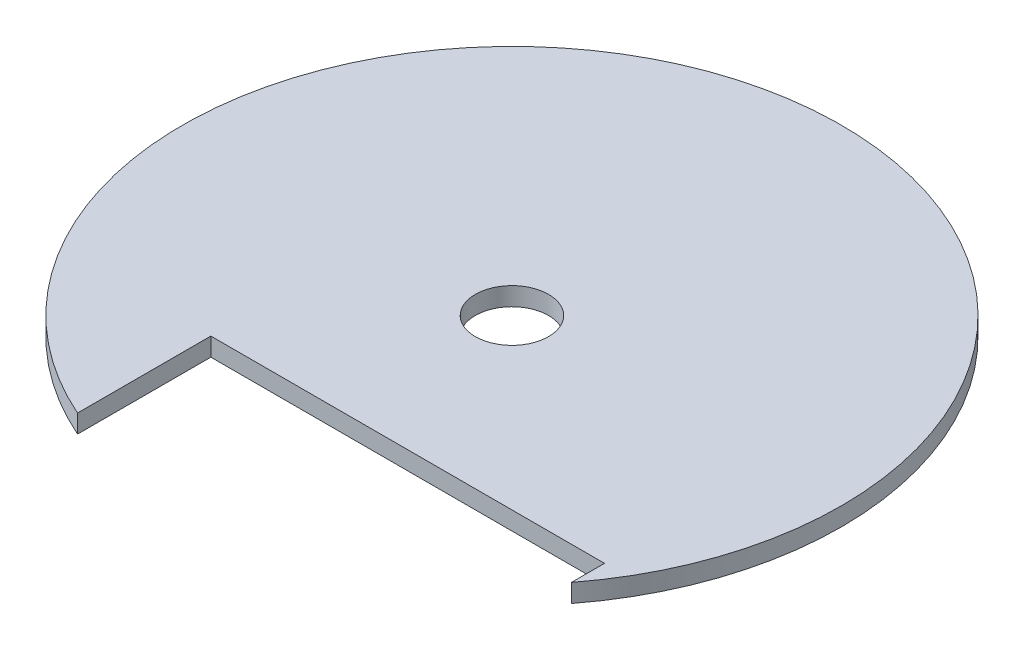
ISO-10303-21;
HEADER;
FILE_DESCRIPTION(('STEP AP214'),'2;1');
FILE_NAME('part.step','',(''),(''),'','','');
FILE_SCHEMA(('AUTOMOTIVE_DESIGN { 1 0 10303 214 1 1 1 1 }'));
ENDSEC;
DATA;
#1=APPLICATION_CONTEXT('core data for automotive mechanical design processes');
#2=APPLICATION_PROTOCOL_DEFINITION('international standard','automotive_design',2000,#1);
#3=PRODUCT_CONTEXT('',#1,'mechanical');
#4=PRODUCT('Part','Part','',(#3));
#5=PRODUCT_RELATED_PRODUCT_CATEGORY('part','',(#4));
#6=PRODUCT_DEFINITION_FORMATION('','',#4);
#7=PRODUCT_DEFINITION_CONTEXT('part definition',#1,'design');
#8=PRODUCT_DEFINITION('design','',#6,#7);
#9=PRODUCT_DEFINITION_SHAPE('','',#8);
#10=(LENGTH_UNIT() NAMED_UNIT(*) SI_UNIT(.MILLI.,.METRE.));
#11=(NAMED_UNIT(*) PLANE_ANGLE_UNIT() SI_UNIT($,.RADIAN.));
#12=(NAMED_UNIT(*) SI_UNIT($,.STERADIAN.) SOLID_ANGLE_UNIT());
#13=UNCERTAINTY_MEASURE_WITH_UNIT(LENGTH_MEASURE(1.E-05),#10,'distance_accuracy_value','');
#14=(GEOMETRIC_REPRESENTATION_CONTEXT(3) GLOBAL_UNCERTAINTY_ASSIGNED_CONTEXT((#13)) GLOBAL_UNIT_ASSIGNED_CONTEXT((#10,
#11,#12)) REPRESENTATION_CONTEXT('',''));
#15=CARTESIAN_POINT('',(0.,0.,0.));
#16=DIRECTION('',(0.,0.,1.));
#17=DIRECTION('',(1.,0.,0.));
#18=AXIS2_PLACEMENT_3D('',#15,#16,#17);
#19=CARTESIAN_POINT('',(0.,2.,0.));
#20=DIRECTION('',(0.,1.,0.));
#21=DIRECTION('',(0.,0.,1.));
#22=AXIS2_PLACEMENT_3D('',#19,#20,#21);
#23=PLANE('',#22);
#24=DIRECTION('',(0.,0.,-1.));
#25=VECTOR('',#24,1.);
#26=CARTESIAN_POINT('',(28.5,2.,61.3904750535764));
#27=LINE('',#26,#25);
#28=CARTESIAN_POINT('',(28.5,2.,21.9943174479228));
#29=VERTEX_POINT('',#28);
#30=CARTESIAN_POINT('',(28.5,2.,18.3904750535764));
#31=VERTEX_POINT('',#30);
#32=EDGE_CURVE('E87',#29,#31,#27,.T.);
#33=ORIENTED_EDGE('',*,*,#32,.F.);
#34=CARTESIAN_POINT('',(0.,2.,0.));
#35=DIRECTION('',(0.,1.,0.));
#36=DIRECTION('',(0.,0.,1.));
#37=AXIS2_PLACEMENT_3D('',#34,#35,#36);
#38=CIRCLE('',#37,36.);
#39=CARTESIAN_POINT('',(-14.5,2.,32.9507207811908));
#40=VERTEX_POINT('',#39);
#41=EDGE_CURVE('E128',#29,#40,#38,.T.);
#42=ORIENTED_EDGE('',*,*,#41,.T.);
#43=DIRECTION('',(0.,0.,1.));
#44=VECTOR('',#43,1.);
#45=CARTESIAN_POINT('',(-14.5,2.,61.3904750535764));
#46=LINE('',#45,#44);
#47=CARTESIAN_POINT('',(-14.5,2.,18.3904750535764));
#48=VERTEX_POINT('',#47);
#49=EDGE_CURVE('E58',#48,#40,#46,.T.);
#50=ORIENTED_EDGE('',*,*,#49,.F.);
#51=DIRECTION('',(-1.,0.,0.));
#52=VECTOR('',#51,1.);
#53=CARTESIAN_POINT('',(-14.5,2.,18.3904750535764));
#54=LINE('',#53,#52);
#55=EDGE_CURVE('E109',#31,#48,#54,.T.);
#56=ORIENTED_EDGE('',*,*,#55,.F.);
#57=EDGE_LOOP('',(#33,#42,#50,#56));
#58=FACE_BOUND('',#57,.T.);
#59=CARTESIAN_POINT('',(0.,2.,0.));
#60=DIRECTION('',(0.,1.,0.));
#61=DIRECTION('',(0.,0.,1.));
#62=AXIS2_PLACEMENT_3D('',#59,#60,#61);
#63=CIRCLE('',#62,4.);
#64=CARTESIAN_POINT('',(0.,2.,4.));
#65=VERTEX_POINT('',#64);
#66=EDGE_CURVE('E121',#65,#65,#63,.T.);
#67=ORIENTED_EDGE('',*,*,#66,.F.);
#68=EDGE_LOOP('',(#67));
#69=FACE_BOUND('',#68,.T.);
#70=ADVANCED_FACE('F42',(#58,#69),#23,.T.);
#71=CARTESIAN_POINT('',(0.,0.,0.));
#72=DIRECTION('',(0.,1.,0.));
#73=DIRECTION('',(0.,0.,1.));
#74=AXIS2_PLACEMENT_3D('',#71,#72,#73);
#75=PLANE('',#74);
#76=CARTESIAN_POINT('',(0.,0.,0.));
#77=DIRECTION('',(0.,1.,0.));
#78=DIRECTION('',(0.,0.,1.));
#79=AXIS2_PLACEMENT_3D('',#76,#77,#78);
#80=CIRCLE('',#79,36.);
#81=CARTESIAN_POINT('',(28.5,0.,21.9943174479228));
#82=VERTEX_POINT('',#81);
#83=CARTESIAN_POINT('',(-14.5,0.,32.9507207811908));
#84=VERTEX_POINT('',#83);
#85=EDGE_CURVE('E105',#82,#84,#80,.T.);
#86=ORIENTED_EDGE('',*,*,#85,.F.);
#87=DIRECTION('',(0.,0.,-1.));
#88=VECTOR('',#87,1.);
#89=CARTESIAN_POINT('',(28.5,0.,61.3904750535764));
#90=LINE('',#89,#88);
#91=CARTESIAN_POINT('',(28.5,0.,18.3904750535764));
#92=VERTEX_POINT('',#91);
#93=EDGE_CURVE('E85',#82,#92,#90,.T.);
#94=ORIENTED_EDGE('',*,*,#93,.T.);
#95=DIRECTION('',(-1.,0.,0.));
#96=VECTOR('',#95,1.);
#97=CARTESIAN_POINT('',(-14.5,0.,18.3904750535764));
#98=LINE('',#97,#96);
#99=CARTESIAN_POINT('',(-14.5,0.,18.3904750535764));
#100=VERTEX_POINT('',#99);
#101=EDGE_CURVE('E96',#92,#100,#98,.T.);
#102=ORIENTED_EDGE('',*,*,#101,.T.);
#103=DIRECTION('',(0.,0.,1.));
#104=VECTOR('',#103,1.);
#105=CARTESIAN_POINT('',(-14.5,0.,61.3904750535764));
#106=LINE('',#105,#104);
#107=EDGE_CURVE('E93',#100,#84,#106,.T.);
#108=ORIENTED_EDGE('',*,*,#107,.T.);
#109=EDGE_LOOP('',(#86,#94,#102,#108));
#110=FACE_BOUND('',#109,.T.);
#111=CARTESIAN_POINT('',(0.,0.,0.));
#112=DIRECTION('',(0.,1.,0.));
#113=DIRECTION('',(0.,0.,1.));
#114=AXIS2_PLACEMENT_3D('',#111,#112,#113);
#115=CIRCLE('',#114,4.);
#116=CARTESIAN_POINT('',(0.,0.,4.));
#117=VERTEX_POINT('',#116);
#118=EDGE_CURVE('E119',#117,#117,#115,.T.);
#119=ORIENTED_EDGE('',*,*,#118,.T.);
#120=EDGE_LOOP('',(#119));
#121=FACE_BOUND('',#120,.T.);
#122=ADVANCED_FACE('F102',(#110,#121),#75,.F.);
#123=CARTESIAN_POINT('',(0.,2.,0.));
#124=DIRECTION('',(0.,-1.,0.));
#125=DIRECTION('',(0.,0.,-1.));
#126=AXIS2_PLACEMENT_3D('',#123,#124,#125);
#127=CYLINDRICAL_SURFACE('',#126,36.);
#128=ORIENTED_EDGE('',*,*,#41,.F.);
#129=DIRECTION('',(0.,-1.,0.));
#130=VECTOR('',#129,1.);
#131=CARTESIAN_POINT('',(28.5,2.,21.9943174479228));
#132=LINE('',#131,#130);
#133=EDGE_CURVE('E11',#29,#82,#132,.T.);
#134=ORIENTED_EDGE('',*,*,#133,.T.);
#135=ORIENTED_EDGE('',*,*,#85,.T.);
#136=DIRECTION('',(0.,-1.,0.));
#137=VECTOR('',#136,1.);
#138=CARTESIAN_POINT('',(-14.5,2.,32.9507207811908));
#139=LINE('',#138,#137);
#140=EDGE_CURVE('E51',#84,#40,#139,.F.);
#141=ORIENTED_EDGE('',*,*,#140,.T.);
#142=EDGE_LOOP('',(#128,#134,#135,#141));
#143=FACE_BOUND('',#142,.T.);
#144=ADVANCED_FACE('F44',(#143),#127,.T.);
#145=CARTESIAN_POINT('',(0.,2.,0.));
#146=DIRECTION('',(0.,-1.,0.));
#147=DIRECTION('',(0.,0.,-1.));
#148=AXIS2_PLACEMENT_3D('',#145,#146,#147);
#149=CYLINDRICAL_SURFACE('',#148,4.);
#150=ORIENTED_EDGE('',*,*,#66,.T.);
#151=EDGE_LOOP('',(#150));
#152=FACE_BOUND('',#151,.T.);
#153=ORIENTED_EDGE('',*,*,#118,.F.);
#154=EDGE_LOOP('',(#153));
#155=FACE_BOUND('',#154,.T.);
#156=ADVANCED_FACE('F142',(#152,#155),#149,.F.);
#157=CARTESIAN_POINT('',(28.5,0.,61.3904750535764));
#158=DIRECTION('',(1.,0.,0.));
#159=DIRECTION('',(0.,0.,-1.));
#160=AXIS2_PLACEMENT_3D('',#157,#158,#159);
#161=PLANE('',#160);
#162=ORIENTED_EDGE('',*,*,#32,.T.);
#163=DIRECTION('',(0.,1.,0.));
#164=VECTOR('',#163,1.);
#165=CARTESIAN_POINT('',(28.5,0.,18.3904750535764));
#166=LINE('',#165,#164);
#167=EDGE_CURVE('E81',#92,#31,#166,.T.);
#168=ORIENTED_EDGE('',*,*,#167,.F.);
#169=ORIENTED_EDGE('',*,*,#93,.F.);
#170=ORIENTED_EDGE('',*,*,#133,.F.);
#171=EDGE_LOOP('',(#162,#168,#169,#170));
#172=FACE_BOUND('',#171,.T.);
#173=ADVANCED_FACE('F83',(#172),#161,.F.);
#174=CARTESIAN_POINT('',(-14.5,0.,61.3904750535764));
#175=DIRECTION('',(-1.,0.,0.));
#176=DIRECTION('',(0.,0.,1.));
#177=AXIS2_PLACEMENT_3D('',#174,#175,#176);
#178=PLANE('',#177);
#179=ORIENTED_EDGE('',*,*,#107,.F.);
#180=DIRECTION('',(0.,1.,0.));
#181=VECTOR('',#180,1.);
#182=CARTESIAN_POINT('',(-14.5,0.,18.3904750535764));
#183=LINE('',#182,#181);
#184=EDGE_CURVE('E92',#100,#48,#183,.T.);
#185=ORIENTED_EDGE('',*,*,#184,.T.);
#186=ORIENTED_EDGE('',*,*,#49,.T.);
#187=ORIENTED_EDGE('',*,*,#140,.F.);
#188=EDGE_LOOP('',(#179,#185,#186,#187));
#189=FACE_BOUND('',#188,.T.);
#190=ADVANCED_FACE('F154',(#189),#178,.F.);
#191=CARTESIAN_POINT('',(-14.5,0.,18.3904750535764));
#192=DIRECTION('',(0.,0.,-1.));
#193=DIRECTION('',(-1.,0.,0.));
#194=AXIS2_PLACEMENT_3D('',#191,#192,#193);
#195=PLANE('',#194);
#196=ORIENTED_EDGE('',*,*,#55,.T.);
#197=ORIENTED_EDGE('',*,*,#184,.F.);
#198=ORIENTED_EDGE('',*,*,#101,.F.);
#199=ORIENTED_EDGE('',*,*,#167,.T.);
#200=EDGE_LOOP('',(#196,#197,#198,#199));
#201=FACE_BOUND('',#200,.T.);
#202=ADVANCED_FACE('F97',(#201),#195,.F.);
#203=CLOSED_SHELL('',(#70,#122,#144,#156,#173,#190,#202));
#204=MANIFOLD_SOLID_BREP('B2',#203);
#205=ADVANCED_BREP_SHAPE_REPRESENTATION('',(#18,#204),#14);
#206=SHAPE_DEFINITION_REPRESENTATION(#9,#205);
ENDSEC;
END-ISO-10303-21;
